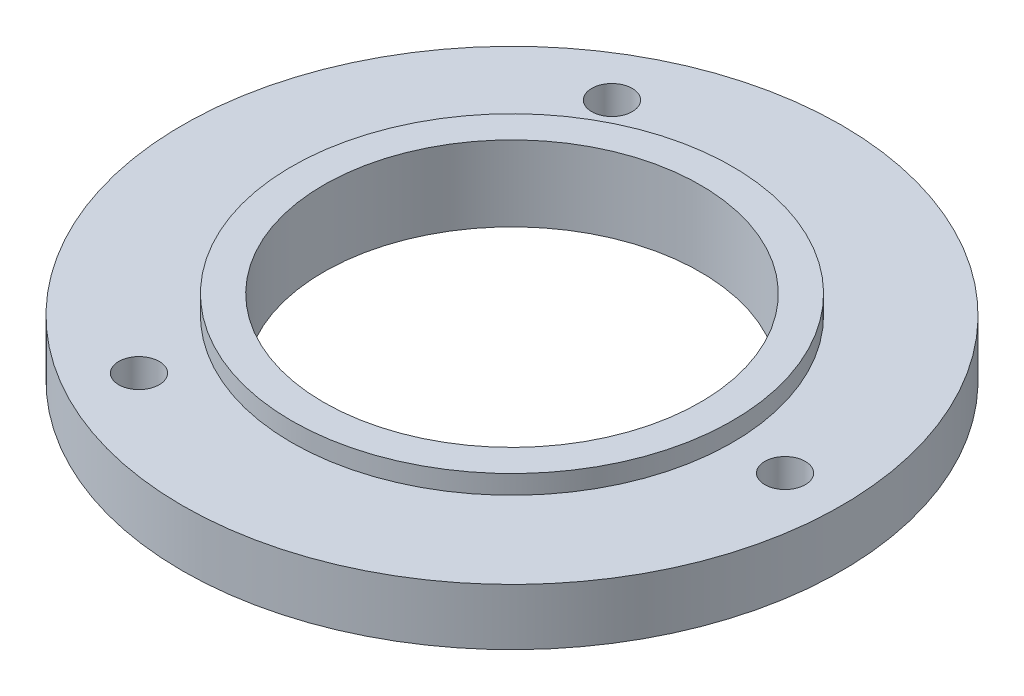
ISO-10303-21;
HEADER;
FILE_DESCRIPTION(('STEP AP214'),'2;1');
FILE_NAME('part.step','',(''),(''),'','','');
FILE_SCHEMA(('AUTOMOTIVE_DESIGN { 1 0 10303 214 1 1 1 1 }'));
ENDSEC;
DATA;
#1=APPLICATION_CONTEXT('core data for automotive mechanical design processes');
#2=APPLICATION_PROTOCOL_DEFINITION('international standard','automotive_design',2000,#1);
#3=PRODUCT_CONTEXT('',#1,'mechanical');
#4=PRODUCT('Part','Part','',(#3));
#5=PRODUCT_RELATED_PRODUCT_CATEGORY('part','',(#4));
#6=PRODUCT_DEFINITION_FORMATION('','',#4);
#7=PRODUCT_DEFINITION_CONTEXT('part definition',#1,'design');
#8=PRODUCT_DEFINITION('design','',#6,#7);
#9=PRODUCT_DEFINITION_SHAPE('','',#8);
#10=(LENGTH_UNIT() NAMED_UNIT(*) SI_UNIT(.MILLI.,.METRE.));
#11=(NAMED_UNIT(*) PLANE_ANGLE_UNIT() SI_UNIT($,.RADIAN.));
#12=(NAMED_UNIT(*) SI_UNIT($,.STERADIAN.) SOLID_ANGLE_UNIT());
#13=UNCERTAINTY_MEASURE_WITH_UNIT(LENGTH_MEASURE(1.E-05),#10,'distance_accuracy_value','');
#14=(GEOMETRIC_REPRESENTATION_CONTEXT(3) GLOBAL_UNCERTAINTY_ASSIGNED_CONTEXT((#13)) GLOBAL_UNIT_ASSIGNED_CONTEXT((#10,
#11,#12)) REPRESENTATION_CONTEXT('',''));
#15=CARTESIAN_POINT('',(0.,0.,0.));
#16=DIRECTION('',(0.,0.,1.));
#17=DIRECTION('',(1.,0.,0.));
#18=AXIS2_PLACEMENT_3D('',#15,#16,#17);
#19=CARTESIAN_POINT('',(0.,6.,0.));
#20=DIRECTION('',(0.,1.,0.));
#21=DIRECTION('',(0.,0.,1.));
#22=AXIS2_PLACEMENT_3D('',#19,#20,#21);
#23=PLANE('',#22);
#24=CARTESIAN_POINT('',(0.,6.,0.));
#25=DIRECTION('',(0.,1.,0.));
#26=DIRECTION('',(0.,0.,1.));
#27=AXIS2_PLACEMENT_3D('',#24,#25,#26);
#28=CIRCLE('',#27,35.);
#29=CARTESIAN_POINT('',(0.,6.,35.));
#30=VERTEX_POINT('',#29);
#31=EDGE_CURVE('E69',#30,#30,#28,.T.);
#32=ORIENTED_EDGE('',*,*,#31,.T.);
#33=EDGE_LOOP('',(#32));
#34=FACE_BOUND('',#33,.T.);
#35=CARTESIAN_POINT('',(-14.4999999999998,6.,-25.1147367097489));
#36=DIRECTION('',(0.,1.,0.));
#37=DIRECTION('',(0.,0.,1.));
#38=AXIS2_PLACEMENT_3D('',#35,#36,#37);
#39=CIRCLE('',#38,2.15);
#40=CARTESIAN_POINT('',(-14.4999999999998,6.,-22.9647367097489));
#41=VERTEX_POINT('',#40);
#42=EDGE_CURVE('E82',#41,#41,#39,.T.);
#43=ORIENTED_EDGE('',*,*,#42,.F.);
#44=EDGE_LOOP('',(#43));
#45=FACE_BOUND('',#44,.T.);
#46=CARTESIAN_POINT('',(-14.5000000000001,6.,25.1147367097486));
#47=DIRECTION('',(0.,1.,0.));
#48=DIRECTION('',(0.,0.,1.));
#49=AXIS2_PLACEMENT_3D('',#46,#47,#48);
#50=CIRCLE('',#49,2.15);
#51=CARTESIAN_POINT('',(-14.5000000000001,6.,27.2647367097486));
#52=VERTEX_POINT('',#51);
#53=EDGE_CURVE('E86',#52,#52,#50,.T.);
#54=ORIENTED_EDGE('',*,*,#53,.F.);
#55=EDGE_LOOP('',(#54));
#56=FACE_BOUND('',#55,.T.);
#57=CARTESIAN_POINT('',(29.,6.,0.));
#58=DIRECTION('',(0.,1.,0.));
#59=DIRECTION('',(0.,0.,1.));
#60=AXIS2_PLACEMENT_3D('',#57,#58,#59);
#61=CIRCLE('',#60,2.15);
#62=CARTESIAN_POINT('',(29.,6.,2.15));
#63=VERTEX_POINT('',#62);
#64=EDGE_CURVE('E81',#63,#63,#61,.T.);
#65=ORIENTED_EDGE('',*,*,#64,.F.);
#66=EDGE_LOOP('',(#65));
#67=FACE_BOUND('',#66,.T.);
#68=CARTESIAN_POINT('',(0.,6.,0.));
#69=DIRECTION('',(0.,1.,0.));
#70=DIRECTION('',(0.,0.,1.));
#71=AXIS2_PLACEMENT_3D('',#68,#69,#70);
#72=CIRCLE('',#71,23.4);
#73=CARTESIAN_POINT('',(0.,6.,23.4));
#74=VERTEX_POINT('',#73);
#75=EDGE_CURVE('E94',#74,#74,#72,.T.);
#76=ORIENTED_EDGE('',*,*,#75,.F.);
#77=EDGE_LOOP('',(#76));
#78=FACE_BOUND('',#77,.T.);
#79=ADVANCED_FACE('F37',(#34,#45,#56,#67,#78),#23,.T.);
#80=CARTESIAN_POINT('',(0.,0.,0.));
#81=DIRECTION('',(0.,1.,0.));
#82=DIRECTION('',(0.,0.,1.));
#83=AXIS2_PLACEMENT_3D('',#80,#81,#82);
#84=PLANE('',#83);
#85=CARTESIAN_POINT('',(-14.5000000000001,0.,25.1147367097486));
#86=DIRECTION('',(0.,1.,0.));
#87=DIRECTION('',(0.,0.,1.));
#88=AXIS2_PLACEMENT_3D('',#85,#86,#87);
#89=CIRCLE('',#88,4.15);
#90=CARTESIAN_POINT('',(-14.5000000000001,0.,29.2647367097486));
#91=VERTEX_POINT('',#90);
#92=EDGE_CURVE('E55',#91,#91,#89,.T.);
#93=ORIENTED_EDGE('',*,*,#92,.T.);
#94=EDGE_LOOP('',(#93));
#95=FACE_BOUND('',#94,.T.);
#96=CARTESIAN_POINT('',(29.,0.,0.));
#97=DIRECTION('',(0.,1.,0.));
#98=DIRECTION('',(0.,0.,1.));
#99=AXIS2_PLACEMENT_3D('',#96,#97,#98);
#100=CIRCLE('',#99,4.15);
#101=CARTESIAN_POINT('',(29.,0.,4.15));
#102=VERTEX_POINT('',#101);
#103=EDGE_CURVE('E61',#102,#102,#100,.T.);
#104=ORIENTED_EDGE('',*,*,#103,.T.);
#105=EDGE_LOOP('',(#104));
#106=FACE_BOUND('',#105,.T.);
#107=CARTESIAN_POINT('',(-14.4999999999998,0.,-25.1147367097489));
#108=DIRECTION('',(0.,1.,0.));
#109=DIRECTION('',(0.,0.,1.));
#110=AXIS2_PLACEMENT_3D('',#107,#108,#109);
#111=CIRCLE('',#110,4.15);
#112=CARTESIAN_POINT('',(-14.4999999999998,0.,-20.9647367097489));
#113=VERTEX_POINT('',#112);
#114=EDGE_CURVE('E65',#113,#113,#111,.T.);
#115=ORIENTED_EDGE('',*,*,#114,.T.);
#116=EDGE_LOOP('',(#115));
#117=FACE_BOUND('',#116,.T.);
#118=CARTESIAN_POINT('',(0.,0.,0.));
#119=DIRECTION('',(0.,1.,0.));
#120=DIRECTION('',(0.,0.,1.));
#121=AXIS2_PLACEMENT_3D('',#118,#119,#120);
#122=CIRCLE('',#121,35.);
#123=CARTESIAN_POINT('',(0.,0.,35.));
#124=VERTEX_POINT('',#123);
#125=EDGE_CURVE('E70',#124,#124,#122,.T.);
#126=ORIENTED_EDGE('',*,*,#125,.F.);
#127=EDGE_LOOP('',(#126));
#128=FACE_BOUND('',#127,.T.);
#129=CARTESIAN_POINT('',(0.,0.,0.));
#130=DIRECTION('',(0.,1.,0.));
#131=DIRECTION('',(0.,0.,1.));
#132=AXIS2_PLACEMENT_3D('',#129,#130,#131);
#133=CIRCLE('',#132,20.);
#134=CARTESIAN_POINT('',(0.,0.,20.));
#135=VERTEX_POINT('',#134);
#136=EDGE_CURVE('E74',#135,#135,#133,.T.);
#137=ORIENTED_EDGE('',*,*,#136,.T.);
#138=EDGE_LOOP('',(#137));
#139=FACE_BOUND('',#138,.T.);
#140=ADVANCED_FACE('F122',(#95,#106,#117,#128,#139),#84,.F.);
#141=CARTESIAN_POINT('',(0.,6.,0.));
#142=DIRECTION('',(0.,-1.,0.));
#143=DIRECTION('',(0.,0.,-1.));
#144=AXIS2_PLACEMENT_3D('',#141,#142,#143);
#145=CYLINDRICAL_SURFACE('',#144,35.);
#146=ORIENTED_EDGE('',*,*,#31,.F.);
#147=EDGE_LOOP('',(#146));
#148=FACE_BOUND('',#147,.T.);
#149=ORIENTED_EDGE('',*,*,#125,.T.);
#150=EDGE_LOOP('',(#149));
#151=FACE_BOUND('',#150,.T.);
#152=ADVANCED_FACE('F128',(#148,#151),#145,.T.);
#153=CARTESIAN_POINT('',(0.,6.,0.));
#154=DIRECTION('',(0.,-1.,0.));
#155=DIRECTION('',(0.,0.,-1.));
#156=AXIS2_PLACEMENT_3D('',#153,#154,#155);
#157=CYLINDRICAL_SURFACE('',#156,20.);
#158=ORIENTED_EDGE('',*,*,#136,.F.);
#159=EDGE_LOOP('',(#158));
#160=FACE_BOUND('',#159,.T.);
#161=CARTESIAN_POINT('',(0.,8.,0.));
#162=DIRECTION('',(0.,1.,0.));
#163=DIRECTION('',(0.,0.,1.));
#164=AXIS2_PLACEMENT_3D('',#161,#162,#163);
#165=CIRCLE('',#164,20.);
#166=CARTESIAN_POINT('',(0.,8.,20.));
#167=VERTEX_POINT('',#166);
#168=EDGE_CURVE('E98',#167,#167,#165,.T.);
#169=ORIENTED_EDGE('',*,*,#168,.T.);
#170=EDGE_LOOP('',(#169));
#171=FACE_BOUND('',#170,.T.);
#172=ADVANCED_FACE('F106',(#160,#171),#157,.F.);
#173=CARTESIAN_POINT('',(-14.4999999999998,-64.,-25.1147367097489));
#174=DIRECTION('',(0.,1.,0.));
#175=DIRECTION('',(0.,0.,1.));
#176=AXIS2_PLACEMENT_3D('',#173,#174,#175);
#177=CYLINDRICAL_SURFACE('',#176,2.15);
#178=CARTESIAN_POINT('',(-14.4999999999998,2.,-25.1147367097489));
#179=DIRECTION('',(0.,1.,0.));
#180=DIRECTION('',(0.,0.,1.));
#181=AXIS2_PLACEMENT_3D('',#178,#179,#180);
#182=CIRCLE('',#181,2.15);
#183=CARTESIAN_POINT('',(-14.4999999999998,2.,-22.9647367097489));
#184=VERTEX_POINT('',#183);
#185=EDGE_CURVE('E10',#184,#184,#182,.F.);
#186=ORIENTED_EDGE('',*,*,#185,.T.);
#187=EDGE_LOOP('',(#186));
#188=FACE_BOUND('',#187,.T.);
#189=ORIENTED_EDGE('',*,*,#42,.T.);
#190=EDGE_LOOP('',(#189));
#191=FACE_BOUND('',#190,.T.);
#192=ADVANCED_FACE('F157',(#188,#191),#177,.F.);
#193=CARTESIAN_POINT('',(-14.5000000000001,-64.,25.1147367097486));
#194=DIRECTION('',(0.,1.,0.));
#195=DIRECTION('',(0.,0.,1.));
#196=AXIS2_PLACEMENT_3D('',#193,#194,#195);
#197=CYLINDRICAL_SURFACE('',#196,2.15);
#198=CARTESIAN_POINT('',(-14.5000000000001,2.,25.1147367097486));
#199=DIRECTION('',(0.,1.,0.));
#200=DIRECTION('',(0.,0.,1.));
#201=AXIS2_PLACEMENT_3D('',#198,#199,#200);
#202=CIRCLE('',#201,2.15);
#203=CARTESIAN_POINT('',(-14.5000000000001,2.,27.2647367097486));
#204=VERTEX_POINT('',#203);
#205=EDGE_CURVE('E50',#204,#204,#202,.F.);
#206=ORIENTED_EDGE('',*,*,#205,.T.);
#207=EDGE_LOOP('',(#206));
#208=FACE_BOUND('',#207,.T.);
#209=ORIENTED_EDGE('',*,*,#53,.T.);
#210=EDGE_LOOP('',(#209));
#211=FACE_BOUND('',#210,.T.);
#212=ADVANCED_FACE('F161',(#208,#211),#197,.F.);
#213=CARTESIAN_POINT('',(29.,-64.,0.));
#214=DIRECTION('',(0.,1.,0.));
#215=DIRECTION('',(0.,0.,1.));
#216=AXIS2_PLACEMENT_3D('',#213,#214,#215);
#217=CYLINDRICAL_SURFACE('',#216,2.15);
#218=CARTESIAN_POINT('',(29.,2.,0.));
#219=DIRECTION('',(0.,1.,0.));
#220=DIRECTION('',(0.,0.,1.));
#221=AXIS2_PLACEMENT_3D('',#218,#219,#220);
#222=CIRCLE('',#221,2.15);
#223=CARTESIAN_POINT('',(29.,2.,2.15));
#224=VERTEX_POINT('',#223);
#225=EDGE_CURVE('E45',#224,#224,#222,.F.);
#226=ORIENTED_EDGE('',*,*,#225,.T.);
#227=EDGE_LOOP('',(#226));
#228=FACE_BOUND('',#227,.T.);
#229=ORIENTED_EDGE('',*,*,#64,.T.);
#230=EDGE_LOOP('',(#229));
#231=FACE_BOUND('',#230,.T.);
#232=ADVANCED_FACE('F140',(#228,#231),#217,.F.);
#233=CARTESIAN_POINT('',(-14.5000000000001,2.,25.1147367097486));
#234=DIRECTION('',(0.,1.,0.));
#235=DIRECTION('',(0.,0.,1.));
#236=AXIS2_PLACEMENT_3D('',#233,#234,#235);
#237=TOROIDAL_SURFACE('',#236,4.15,2.);
#238=ORIENTED_EDGE('',*,*,#205,.F.);
#239=EDGE_LOOP('',(#238));
#240=FACE_BOUND('',#239,.T.);
#241=ORIENTED_EDGE('',*,*,#92,.F.);
#242=EDGE_LOOP('',(#241));
#243=FACE_BOUND('',#242,.T.);
#244=ADVANCED_FACE('F138',(#240,#243),#237,.T.);
#245=CARTESIAN_POINT('',(29.,2.,0.));
#246=DIRECTION('',(0.,1.,0.));
#247=DIRECTION('',(0.,0.,1.));
#248=AXIS2_PLACEMENT_3D('',#245,#246,#247);
#249=TOROIDAL_SURFACE('',#248,4.15,2.);
#250=ORIENTED_EDGE('',*,*,#225,.F.);
#251=EDGE_LOOP('',(#250));
#252=FACE_BOUND('',#251,.T.);
#253=ORIENTED_EDGE('',*,*,#103,.F.);
#254=EDGE_LOOP('',(#253));
#255=FACE_BOUND('',#254,.T.);
#256=ADVANCED_FACE('F119',(#252,#255),#249,.T.);
#257=CARTESIAN_POINT('',(-14.4999999999998,2.,-25.1147367097489));
#258=DIRECTION('',(0.,1.,0.));
#259=DIRECTION('',(0.,0.,1.));
#260=AXIS2_PLACEMENT_3D('',#257,#258,#259);
#261=TOROIDAL_SURFACE('',#260,4.15,2.);
#262=ORIENTED_EDGE('',*,*,#185,.F.);
#263=EDGE_LOOP('',(#262));
#264=FACE_BOUND('',#263,.T.);
#265=ORIENTED_EDGE('',*,*,#114,.F.);
#266=EDGE_LOOP('',(#265));
#267=FACE_BOUND('',#266,.T.);
#268=ADVANCED_FACE('F39',(#264,#267),#261,.T.);
#269=CARTESIAN_POINT('',(0.,8.,0.));
#270=DIRECTION('',(0.,1.,0.));
#271=DIRECTION('',(0.,0.,1.));
#272=AXIS2_PLACEMENT_3D('',#269,#270,#271);
#273=PLANE('',#272);
#274=CARTESIAN_POINT('',(0.,8.,0.));
#275=DIRECTION('',(0.,1.,0.));
#276=DIRECTION('',(0.,0.,1.));
#277=AXIS2_PLACEMENT_3D('',#274,#275,#276);
#278=CIRCLE('',#277,23.4);
#279=CARTESIAN_POINT('',(0.,8.,23.4));
#280=VERTEX_POINT('',#279);
#281=EDGE_CURVE('E87',#280,#280,#278,.T.);
#282=ORIENTED_EDGE('',*,*,#281,.T.);
#283=EDGE_LOOP('',(#282));
#284=FACE_BOUND('',#283,.T.);
#285=ORIENTED_EDGE('',*,*,#168,.F.);
#286=EDGE_LOOP('',(#285));
#287=FACE_BOUND('',#286,.T.);
#288=ADVANCED_FACE('F108',(#284,#287),#273,.T.);
#289=CARTESIAN_POINT('',(0.,8.,0.));
#290=DIRECTION('',(0.,-1.,0.));
#291=DIRECTION('',(0.,0.,-1.));
#292=AXIS2_PLACEMENT_3D('',#289,#290,#291);
#293=CYLINDRICAL_SURFACE('',#292,23.4);
#294=ORIENTED_EDGE('',*,*,#281,.F.);
#295=EDGE_LOOP('',(#294));
#296=FACE_BOUND('',#295,.T.);
#297=ORIENTED_EDGE('',*,*,#75,.T.);
#298=EDGE_LOOP('',(#297));
#299=FACE_BOUND('',#298,.T.);
#300=ADVANCED_FACE('F110',(#296,#299),#293,.T.);
#301=CLOSED_SHELL('',(#79,#140,#152,#172,#192,#212,#232,#244,#256,#268,#288,#300));
#302=MANIFOLD_SOLID_BREP('B2',#301);
#303=ADVANCED_BREP_SHAPE_REPRESENTATION('',(#18,#302),#14);
#304=SHAPE_DEFINITION_REPRESENTATION(#9,#303);
ENDSEC;
END-ISO-10303-21;
